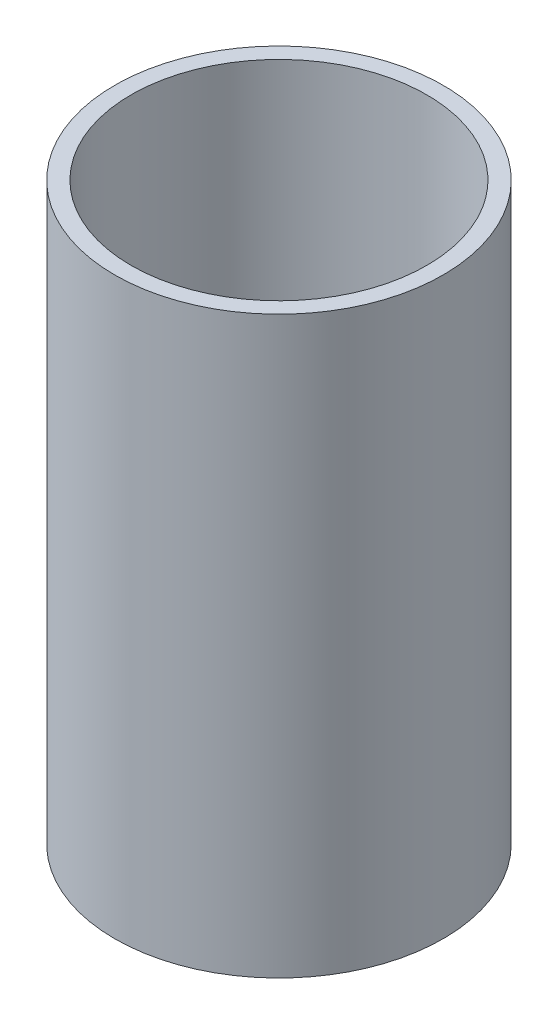
ISO-10303-21;
HEADER;
FILE_DESCRIPTION(('STEP AP214'),'2;1');
FILE_NAME('part.step','',(''),(''),'','','');
FILE_SCHEMA(('AUTOMOTIVE_DESIGN { 1 0 10303 214 1 1 1 1 }'));
ENDSEC;
DATA;
#1=APPLICATION_CONTEXT('core data for automotive mechanical design processes');
#2=APPLICATION_PROTOCOL_DEFINITION('international standard','automotive_design',2000,#1);
#3=PRODUCT_CONTEXT('',#1,'mechanical');
#4=PRODUCT('Part','Part','',(#3));
#5=PRODUCT_RELATED_PRODUCT_CATEGORY('part','',(#4));
#6=PRODUCT_DEFINITION_FORMATION('','',#4);
#7=PRODUCT_DEFINITION_CONTEXT('part definition',#1,'design');
#8=PRODUCT_DEFINITION('design','',#6,#7);
#9=PRODUCT_DEFINITION_SHAPE('','',#8);
#10=(LENGTH_UNIT() NAMED_UNIT(*) SI_UNIT(.MILLI.,.METRE.));
#11=(NAMED_UNIT(*) PLANE_ANGLE_UNIT() SI_UNIT($,.RADIAN.));
#12=(NAMED_UNIT(*) SI_UNIT($,.STERADIAN.) SOLID_ANGLE_UNIT());
#13=UNCERTAINTY_MEASURE_WITH_UNIT(LENGTH_MEASURE(1.E-05),#10,'distance_accuracy_value','');
#14=(GEOMETRIC_REPRESENTATION_CONTEXT(3) GLOBAL_UNCERTAINTY_ASSIGNED_CONTEXT((#13)) GLOBAL_UNIT_ASSIGNED_CONTEXT((#10,
#11,#12)) REPRESENTATION_CONTEXT('',''));
#15=CARTESIAN_POINT('',(0.,0.,0.));
#16=DIRECTION('',(0.,0.,1.));
#17=DIRECTION('',(1.,0.,0.));
#18=AXIS2_PLACEMENT_3D('',#15,#16,#17);
#19=CARTESIAN_POINT('',(0.,70.,0.));
#20=DIRECTION('',(0.,1.,0.));
#21=DIRECTION('',(0.,0.,1.));
#22=AXIS2_PLACEMENT_3D('',#19,#20,#21);
#23=PLANE('',#22);
#24=CARTESIAN_POINT('',(0.,70.,0.));
#25=DIRECTION('',(0.,1.,0.));
#26=DIRECTION('',(0.,0.,1.));
#27=AXIS2_PLACEMENT_3D('',#24,#25,#26);
#28=CIRCLE('',#27,20.);
#29=CARTESIAN_POINT('',(0.,70.,20.));
#30=VERTEX_POINT('',#29);
#31=EDGE_CURVE('E10',#30,#30,#28,.T.);
#32=ORIENTED_EDGE('',*,*,#31,.T.);
#33=EDGE_LOOP('',(#32));
#34=FACE_BOUND('',#33,.T.);
#35=CARTESIAN_POINT('',(0.,70.,0.));
#36=DIRECTION('',(0.,1.,0.));
#37=DIRECTION('',(0.,0.,1.));
#38=AXIS2_PLACEMENT_3D('',#35,#36,#37);
#39=CIRCLE('',#38,18.);
#40=CARTESIAN_POINT('',(0.,70.,18.));
#41=VERTEX_POINT('',#40);
#42=EDGE_CURVE('E49',#41,#41,#39,.T.);
#43=ORIENTED_EDGE('',*,*,#42,.F.);
#44=EDGE_LOOP('',(#43));
#45=FACE_BOUND('',#44,.T.);
#46=ADVANCED_FACE('F38',(#34,#45),#23,.T.);
#47=CARTESIAN_POINT('',(0.,0.,0.));
#48=DIRECTION('',(0.,1.,0.));
#49=DIRECTION('',(0.,0.,1.));
#50=AXIS2_PLACEMENT_3D('',#47,#48,#49);
#51=PLANE('',#50);
#52=CARTESIAN_POINT('',(0.,0.,0.));
#53=DIRECTION('',(0.,1.,0.));
#54=DIRECTION('',(0.,0.,1.));
#55=AXIS2_PLACEMENT_3D('',#52,#53,#54);
#56=CIRCLE('',#55,20.);
#57=CARTESIAN_POINT('',(0.,0.,20.));
#58=VERTEX_POINT('',#57);
#59=EDGE_CURVE('E42',#58,#58,#56,.T.);
#60=ORIENTED_EDGE('',*,*,#59,.F.);
#61=EDGE_LOOP('',(#60));
#62=FACE_BOUND('',#61,.T.);
#63=CARTESIAN_POINT('',(0.,0.,0.));
#64=DIRECTION('',(0.,1.,0.));
#65=DIRECTION('',(0.,0.,1.));
#66=AXIS2_PLACEMENT_3D('',#63,#64,#65);
#67=CIRCLE('',#66,18.);
#68=CARTESIAN_POINT('',(0.,0.,18.));
#69=VERTEX_POINT('',#68);
#70=EDGE_CURVE('E51',#69,#69,#67,.T.);
#71=ORIENTED_EDGE('',*,*,#70,.T.);
#72=EDGE_LOOP('',(#71));
#73=FACE_BOUND('',#72,.T.);
#74=ADVANCED_FACE('F61',(#62,#73),#51,.F.);
#75=CARTESIAN_POINT('',(0.,70.,0.));
#76=DIRECTION('',(0.,-1.,0.));
#77=DIRECTION('',(0.,0.,-1.));
#78=AXIS2_PLACEMENT_3D('',#75,#76,#77);
#79=CYLINDRICAL_SURFACE('',#78,20.);
#80=ORIENTED_EDGE('',*,*,#31,.F.);
#81=EDGE_LOOP('',(#80));
#82=FACE_BOUND('',#81,.T.);
#83=ORIENTED_EDGE('',*,*,#59,.T.);
#84=EDGE_LOOP('',(#83));
#85=FACE_BOUND('',#84,.T.);
#86=ADVANCED_FACE('F40',(#82,#85),#79,.T.);
#87=CARTESIAN_POINT('',(0.,70.,0.));
#88=DIRECTION('',(0.,-1.,0.));
#89=DIRECTION('',(0.,0.,-1.));
#90=AXIS2_PLACEMENT_3D('',#87,#88,#89);
#91=CYLINDRICAL_SURFACE('',#90,18.);
#92=ORIENTED_EDGE('',*,*,#42,.T.);
#93=EDGE_LOOP('',(#92));
#94=FACE_BOUND('',#93,.T.);
#95=ORIENTED_EDGE('',*,*,#70,.F.);
#96=EDGE_LOOP('',(#95));
#97=FACE_BOUND('',#96,.T.);
#98=ADVANCED_FACE('F57',(#94,#97),#91,.F.);
#99=CLOSED_SHELL('',(#46,#74,#86,#98));
#100=MANIFOLD_SOLID_BREP('B2',#99);
#101=ADVANCED_BREP_SHAPE_REPRESENTATION('',(#18,#100),#14);
#102=SHAPE_DEFINITION_REPRESENTATION(#9,#101);
ENDSEC;
END-ISO-10303-21;
